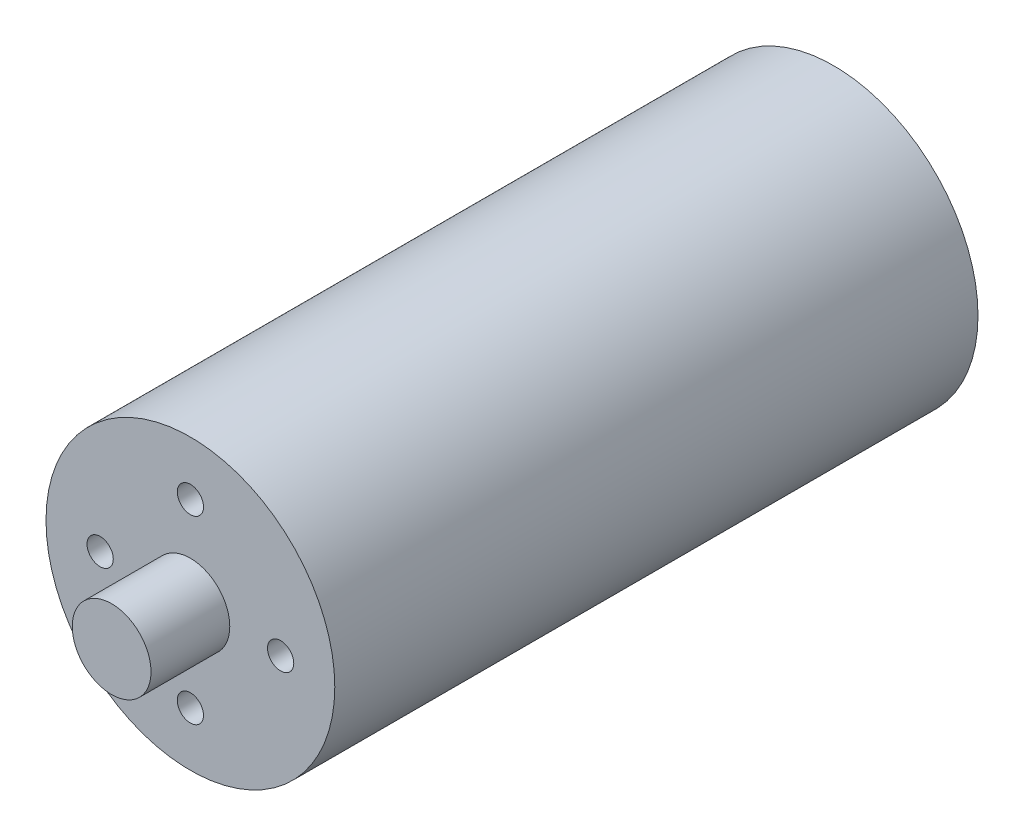
ISO-10303-21;
HEADER;
FILE_DESCRIPTION(('STEP AP214'),'2;1');
FILE_NAME('part.step','',(''),(''),'','','');
FILE_SCHEMA(('AUTOMOTIVE_DESIGN { 1 0 10303 214 1 1 1 1 }'));
ENDSEC;
DATA;
#1=APPLICATION_CONTEXT('core data for automotive mechanical design processes');
#2=APPLICATION_PROTOCOL_DEFINITION('international standard','automotive_design',2000,#1);
#3=PRODUCT_CONTEXT('',#1,'mechanical');
#4=PRODUCT('Part','Part','',(#3));
#5=PRODUCT_RELATED_PRODUCT_CATEGORY('part','',(#4));
#6=PRODUCT_DEFINITION_FORMATION('','',#4);
#7=PRODUCT_DEFINITION_CONTEXT('part definition',#1,'design');
#8=PRODUCT_DEFINITION('design','',#6,#7);
#9=PRODUCT_DEFINITION_SHAPE('','',#8);
#10=(LENGTH_UNIT() NAMED_UNIT(*) SI_UNIT(.MILLI.,.METRE.));
#11=(NAMED_UNIT(*) PLANE_ANGLE_UNIT() SI_UNIT($,.RADIAN.));
#12=(NAMED_UNIT(*) SI_UNIT($,.STERADIAN.) SOLID_ANGLE_UNIT());
#13=UNCERTAINTY_MEASURE_WITH_UNIT(LENGTH_MEASURE(1.E-05),#10,'distance_accuracy_value','');
#14=(GEOMETRIC_REPRESENTATION_CONTEXT(3) GLOBAL_UNCERTAINTY_ASSIGNED_CONTEXT((#13)) GLOBAL_UNIT_ASSIGNED_CONTEXT((#10,
#11,#12)) REPRESENTATION_CONTEXT('',''));
#15=CARTESIAN_POINT('',(0.,0.,0.));
#16=DIRECTION('',(0.,0.,1.));
#17=DIRECTION('',(1.,0.,0.));
#18=AXIS2_PLACEMENT_3D('',#15,#16,#17);
#19=CARTESIAN_POINT('',(0.,0.,49.));
#20=DIRECTION('',(0.,0.,1.));
#21=DIRECTION('',(1.,0.,0.));
#22=AXIS2_PLACEMENT_3D('',#19,#20,#21);
#23=PLANE('',#22);
#24=CARTESIAN_POINT('',(0.,0.,49.));
#25=DIRECTION('',(0.,0.,1.));
#26=DIRECTION('',(1.,0.,0.));
#27=AXIS2_PLACEMENT_3D('',#24,#25,#26);
#28=CIRCLE('',#27,11.);
#29=CARTESIAN_POINT('',(11.,0.,49.));
#30=VERTEX_POINT('',#29);
#31=EDGE_CURVE('E10',#30,#30,#28,.T.);
#32=ORIENTED_EDGE('',*,*,#31,.T.);
#33=EDGE_LOOP('',(#32));
#34=FACE_BOUND('',#33,.T.);
#35=CARTESIAN_POINT('',(6.875,0.,49.));
#36=DIRECTION('',(0.,0.,1.));
#37=DIRECTION('',(1.,0.,0.));
#38=AXIS2_PLACEMENT_3D('',#35,#36,#37);
#39=CIRCLE('',#38,1.);
#40=CARTESIAN_POINT('',(7.875,0.,49.));
#41=VERTEX_POINT('',#40);
#42=EDGE_CURVE('E42',#41,#41,#39,.T.);
#43=ORIENTED_EDGE('',*,*,#42,.F.);
#44=EDGE_LOOP('',(#43));
#45=FACE_BOUND('',#44,.T.);
#46=CARTESIAN_POINT('',(0.,-6.875,49.));
#47=DIRECTION('',(0.,0.,1.));
#48=DIRECTION('',(1.,0.,0.));
#49=AXIS2_PLACEMENT_3D('',#46,#47,#48);
#50=CIRCLE('',#49,1.);
#51=CARTESIAN_POINT('',(0.999999999999976,-6.875,49.));
#52=VERTEX_POINT('',#51);
#53=EDGE_CURVE('E48',#52,#52,#50,.T.);
#54=ORIENTED_EDGE('',*,*,#53,.F.);
#55=EDGE_LOOP('',(#54));
#56=FACE_BOUND('',#55,.T.);
#57=CARTESIAN_POINT('',(-6.875,0.,49.));
#58=DIRECTION('',(0.,0.,1.));
#59=DIRECTION('',(1.,0.,0.));
#60=AXIS2_PLACEMENT_3D('',#57,#58,#59);
#61=CIRCLE('',#60,1.);
#62=CARTESIAN_POINT('',(-5.875,0.,49.));
#63=VERTEX_POINT('',#62);
#64=EDGE_CURVE('E54',#63,#63,#61,.T.);
#65=ORIENTED_EDGE('',*,*,#64,.F.);
#66=EDGE_LOOP('',(#65));
#67=FACE_BOUND('',#66,.T.);
#68=CARTESIAN_POINT('',(0.,6.875,49.));
#69=DIRECTION('',(0.,0.,1.));
#70=DIRECTION('',(1.,0.,0.));
#71=AXIS2_PLACEMENT_3D('',#68,#69,#70);
#72=CIRCLE('',#71,1.);
#73=CARTESIAN_POINT('',(1.00000000000007,6.875,49.));
#74=VERTEX_POINT('',#73);
#75=EDGE_CURVE('E60',#74,#74,#72,.T.);
#76=ORIENTED_EDGE('',*,*,#75,.F.);
#77=EDGE_LOOP('',(#76));
#78=FACE_BOUND('',#77,.T.);
#79=CARTESIAN_POINT('',(0.,0.,49.));
#80=DIRECTION('',(0.,0.,1.));
#81=DIRECTION('',(1.,0.,0.));
#82=AXIS2_PLACEMENT_3D('',#79,#80,#81);
#83=CIRCLE('',#82,3.);
#84=CARTESIAN_POINT('',(3.,0.,49.));
#85=VERTEX_POINT('',#84);
#86=EDGE_CURVE('E66',#85,#85,#83,.T.);
#87=ORIENTED_EDGE('',*,*,#86,.F.);
#88=EDGE_LOOP('',(#87));
#89=FACE_BOUND('',#88,.T.);
#90=ADVANCED_FACE('F29',(#34,#45,#56,#67,#78,#89),#23,.T.);
#91=CARTESIAN_POINT('',(0.,0.,49.));
#92=DIRECTION('',(0.,0.,-1.));
#93=DIRECTION('',(-1.,0.,0.));
#94=AXIS2_PLACEMENT_3D('',#91,#92,#93);
#95=CYLINDRICAL_SURFACE('',#94,11.);
#96=ORIENTED_EDGE('',*,*,#31,.F.);
#97=EDGE_LOOP('',(#96));
#98=FACE_BOUND('',#97,.T.);
#99=CARTESIAN_POINT('',(0.,0.,0.));
#100=DIRECTION('',(0.,0.,1.));
#101=DIRECTION('',(1.,0.,0.));
#102=AXIS2_PLACEMENT_3D('',#99,#100,#101);
#103=CIRCLE('',#102,11.);
#104=CARTESIAN_POINT('',(11.,0.,0.));
#105=VERTEX_POINT('',#104);
#106=EDGE_CURVE('E33',#105,#105,#103,.T.);
#107=ORIENTED_EDGE('',*,*,#106,.T.);
#108=EDGE_LOOP('',(#107));
#109=FACE_BOUND('',#108,.T.);
#110=ADVANCED_FACE('F31',(#98,#109),#95,.T.);
#111=CARTESIAN_POINT('',(0.,0.,0.));
#112=DIRECTION('',(0.,0.,1.));
#113=DIRECTION('',(1.,0.,0.));
#114=AXIS2_PLACEMENT_3D('',#111,#112,#113);
#115=PLANE('',#114);
#116=ORIENTED_EDGE('',*,*,#106,.F.);
#117=EDGE_LOOP('',(#116));
#118=FACE_BOUND('',#117,.T.);
#119=ADVANCED_FACE('F86',(#118),#115,.F.);
#120=CARTESIAN_POINT('',(6.875,0.,46.));
#121=DIRECTION('',(0.,0.,1.));
#122=DIRECTION('',(1.,0.,0.));
#123=AXIS2_PLACEMENT_3D('',#120,#121,#122);
#124=CYLINDRICAL_SURFACE('',#123,1.);
#125=CARTESIAN_POINT('',(6.875,0.,46.));
#126=DIRECTION('',(0.,0.,1.));
#127=DIRECTION('',(1.,0.,0.));
#128=AXIS2_PLACEMENT_3D('',#125,#126,#127);
#129=CIRCLE('',#128,1.);
#130=CARTESIAN_POINT('',(7.875,0.,46.));
#131=VERTEX_POINT('',#130);
#132=EDGE_CURVE('E40',#131,#131,#129,.T.);
#133=ORIENTED_EDGE('',*,*,#132,.F.);
#134=EDGE_LOOP('',(#133));
#135=FACE_BOUND('',#134,.T.);
#136=ORIENTED_EDGE('',*,*,#42,.T.);
#137=EDGE_LOOP('',(#136));
#138=FACE_BOUND('',#137,.T.);
#139=ADVANCED_FACE('F90',(#135,#138),#124,.F.);
#140=CARTESIAN_POINT('',(6.875,0.,46.));
#141=DIRECTION('',(0.,0.,1.));
#142=DIRECTION('',(1.,0.,0.));
#143=AXIS2_PLACEMENT_3D('',#140,#141,#142);
#144=PLANE('',#143);
#145=ORIENTED_EDGE('',*,*,#132,.T.);
#146=EDGE_LOOP('',(#145));
#147=FACE_BOUND('',#146,.T.);
#148=ADVANCED_FACE('F97',(#147),#144,.T.);
#149=CARTESIAN_POINT('',(0.,-6.875,46.));
#150=DIRECTION('',(0.,0.,1.));
#151=DIRECTION('',(1.,0.,0.));
#152=AXIS2_PLACEMENT_3D('',#149,#150,#151);
#153=CYLINDRICAL_SURFACE('',#152,1.);
#154=CARTESIAN_POINT('',(0.,-6.875,46.));
#155=DIRECTION('',(0.,0.,1.));
#156=DIRECTION('',(1.,0.,0.));
#157=AXIS2_PLACEMENT_3D('',#154,#155,#156);
#158=CIRCLE('',#157,1.);
#159=CARTESIAN_POINT('',(0.999999999999976,-6.875,46.));
#160=VERTEX_POINT('',#159);
#161=EDGE_CURVE('E45',#160,#160,#158,.T.);
#162=ORIENTED_EDGE('',*,*,#161,.F.);
#163=EDGE_LOOP('',(#162));
#164=FACE_BOUND('',#163,.T.);
#165=ORIENTED_EDGE('',*,*,#53,.T.);
#166=EDGE_LOOP('',(#165));
#167=FACE_BOUND('',#166,.T.);
#168=ADVANCED_FACE('F104',(#164,#167),#153,.F.);
#169=CARTESIAN_POINT('',(0.,-6.875,46.));
#170=DIRECTION('',(0.,0.,1.));
#171=DIRECTION('',(1.,0.,0.));
#172=AXIS2_PLACEMENT_3D('',#169,#170,#171);
#173=PLANE('',#172);
#174=ORIENTED_EDGE('',*,*,#161,.T.);
#175=EDGE_LOOP('',(#174));
#176=FACE_BOUND('',#175,.T.);
#177=ADVANCED_FACE('F134',(#176),#173,.T.);
#178=CARTESIAN_POINT('',(-6.875,0.,46.));
#179=DIRECTION('',(0.,0.,1.));
#180=DIRECTION('',(1.,0.,0.));
#181=AXIS2_PLACEMENT_3D('',#178,#179,#180);
#182=CYLINDRICAL_SURFACE('',#181,1.);
#183=CARTESIAN_POINT('',(-6.875,0.,46.));
#184=DIRECTION('',(0.,0.,1.));
#185=DIRECTION('',(1.,0.,0.));
#186=AXIS2_PLACEMENT_3D('',#183,#184,#185);
#187=CIRCLE('',#186,1.);
#188=CARTESIAN_POINT('',(-5.875,0.,46.));
#189=VERTEX_POINT('',#188);
#190=EDGE_CURVE('E51',#189,#189,#187,.T.);
#191=ORIENTED_EDGE('',*,*,#190,.F.);
#192=EDGE_LOOP('',(#191));
#193=FACE_BOUND('',#192,.T.);
#194=ORIENTED_EDGE('',*,*,#64,.T.);
#195=EDGE_LOOP('',(#194));
#196=FACE_BOUND('',#195,.T.);
#197=ADVANCED_FACE('F127',(#193,#196),#182,.F.);
#198=CARTESIAN_POINT('',(-6.875,0.,46.));
#199=DIRECTION('',(0.,0.,1.));
#200=DIRECTION('',(1.,0.,0.));
#201=AXIS2_PLACEMENT_3D('',#198,#199,#200);
#202=PLANE('',#201);
#203=ORIENTED_EDGE('',*,*,#190,.T.);
#204=EDGE_LOOP('',(#203));
#205=FACE_BOUND('',#204,.T.);
#206=ADVANCED_FACE('F118',(#205),#202,.T.);
#207=CARTESIAN_POINT('',(0.,6.875,46.));
#208=DIRECTION('',(0.,0.,1.));
#209=DIRECTION('',(1.,0.,0.));
#210=AXIS2_PLACEMENT_3D('',#207,#208,#209);
#211=CYLINDRICAL_SURFACE('',#210,1.);
#212=CARTESIAN_POINT('',(0.,6.875,46.));
#213=DIRECTION('',(0.,0.,1.));
#214=DIRECTION('',(1.,0.,0.));
#215=AXIS2_PLACEMENT_3D('',#212,#213,#214);
#216=CIRCLE('',#215,1.);
#217=CARTESIAN_POINT('',(1.00000000000007,6.875,46.));
#218=VERTEX_POINT('',#217);
#219=EDGE_CURVE('E57',#218,#218,#216,.T.);
#220=ORIENTED_EDGE('',*,*,#219,.F.);
#221=EDGE_LOOP('',(#220));
#222=FACE_BOUND('',#221,.T.);
#223=ORIENTED_EDGE('',*,*,#75,.T.);
#224=EDGE_LOOP('',(#223));
#225=FACE_BOUND('',#224,.T.);
#226=ADVANCED_FACE('F116',(#222,#225),#211,.F.);
#227=CARTESIAN_POINT('',(0.,6.875,46.));
#228=DIRECTION('',(0.,0.,1.));
#229=DIRECTION('',(1.,0.,0.));
#230=AXIS2_PLACEMENT_3D('',#227,#228,#229);
#231=PLANE('',#230);
#232=ORIENTED_EDGE('',*,*,#219,.T.);
#233=EDGE_LOOP('',(#232));
#234=FACE_BOUND('',#233,.T.);
#235=ADVANCED_FACE('F77',(#234),#231,.T.);
#236=CARTESIAN_POINT('',(0.,0.,55.));
#237=DIRECTION('',(0.,0.,-1.));
#238=DIRECTION('',(-1.,0.,0.));
#239=AXIS2_PLACEMENT_3D('',#236,#237,#238);
#240=CYLINDRICAL_SURFACE('',#239,3.);
#241=CARTESIAN_POINT('',(0.,0.,55.));
#242=DIRECTION('',(0.,0.,1.));
#243=DIRECTION('',(1.,0.,0.));
#244=AXIS2_PLACEMENT_3D('',#241,#242,#243);
#245=CIRCLE('',#244,3.);
#246=CARTESIAN_POINT('',(3.,0.,55.));
#247=VERTEX_POINT('',#246);
#248=EDGE_CURVE('E63',#247,#247,#245,.T.);
#249=ORIENTED_EDGE('',*,*,#248,.F.);
#250=EDGE_LOOP('',(#249));
#251=FACE_BOUND('',#250,.T.);
#252=ORIENTED_EDGE('',*,*,#86,.T.);
#253=EDGE_LOOP('',(#252));
#254=FACE_BOUND('',#253,.T.);
#255=ADVANCED_FACE('F74',(#251,#254),#240,.T.);
#256=CARTESIAN_POINT('',(0.,0.,55.));
#257=DIRECTION('',(0.,0.,1.));
#258=DIRECTION('',(1.,0.,0.));
#259=AXIS2_PLACEMENT_3D('',#256,#257,#258);
#260=PLANE('',#259);
#261=ORIENTED_EDGE('',*,*,#248,.T.);
#262=EDGE_LOOP('',(#261));
#263=FACE_BOUND('',#262,.T.);
#264=ADVANCED_FACE('F72',(#263),#260,.T.);
#265=CLOSED_SHELL('',(#90,#110,#119,#139,#148,#168,#177,#197,#206,#226,#235,#255,#264));
#266=MANIFOLD_SOLID_BREP('B2',#265);
#267=ADVANCED_BREP_SHAPE_REPRESENTATION('',(#18,#266),#14);
#268=SHAPE_DEFINITION_REPRESENTATION(#9,#267);
ENDSEC;
END-ISO-10303-21;
